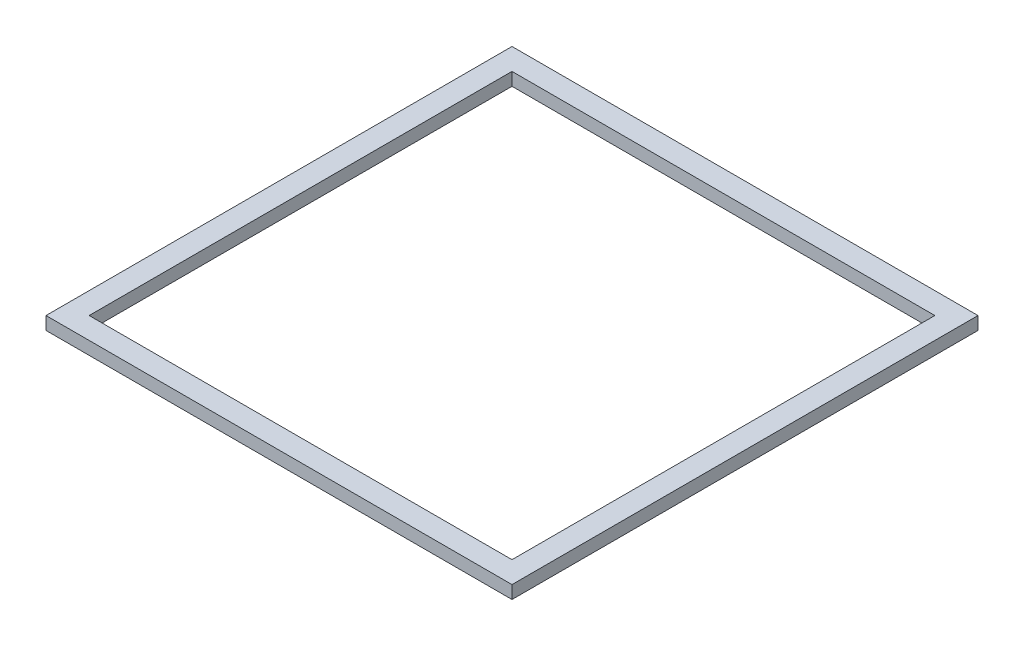
ISO-10303-21;
HEADER;
FILE_DESCRIPTION(('STEP AP214'),'2;1');
FILE_NAME('part.step','',(''),(''),'','','');
FILE_SCHEMA(('AUTOMOTIVE_DESIGN { 1 0 10303 214 1 1 1 1 }'));
ENDSEC;
DATA;
#1=APPLICATION_CONTEXT('core data for automotive mechanical design processes');
#2=APPLICATION_PROTOCOL_DEFINITION('international standard','automotive_design',2000,#1);
#3=PRODUCT_CONTEXT('',#1,'mechanical');
#4=PRODUCT('Part','Part','',(#3));
#5=PRODUCT_RELATED_PRODUCT_CATEGORY('part','',(#4));
#6=PRODUCT_DEFINITION_FORMATION('','',#4);
#7=PRODUCT_DEFINITION_CONTEXT('part definition',#1,'design');
#8=PRODUCT_DEFINITION('design','',#6,#7);
#9=PRODUCT_DEFINITION_SHAPE('','',#8);
#10=(LENGTH_UNIT() NAMED_UNIT(*) SI_UNIT(.MILLI.,.METRE.));
#11=(NAMED_UNIT(*) PLANE_ANGLE_UNIT() SI_UNIT($,.RADIAN.));
#12=(NAMED_UNIT(*) SI_UNIT($,.STERADIAN.) SOLID_ANGLE_UNIT());
#13=UNCERTAINTY_MEASURE_WITH_UNIT(LENGTH_MEASURE(1.E-05),#10,'distance_accuracy_value','');
#14=(GEOMETRIC_REPRESENTATION_CONTEXT(3) GLOBAL_UNCERTAINTY_ASSIGNED_CONTEXT((#13)) GLOBAL_UNIT_ASSIGNED_CONTEXT((#10,
#11,#12)) REPRESENTATION_CONTEXT('',''));
#15=CARTESIAN_POINT('',(0.,0.,0.));
#16=DIRECTION('',(0.,0.,1.));
#17=DIRECTION('',(1.,0.,0.));
#18=AXIS2_PLACEMENT_3D('',#15,#16,#17);
#19=CARTESIAN_POINT('',(0.,3.,0.));
#20=DIRECTION('',(0.,-1.,0.));
#21=DIRECTION('',(0.,0.,-1.));
#22=AXIS2_PLACEMENT_3D('',#19,#20,#21);
#23=PLANE('',#22);
#24=DIRECTION('',(0.,0.,-1.));
#25=VECTOR('',#24,1.);
#26=CARTESIAN_POINT('',(54.,3.,54.));
#27=LINE('',#26,#25);
#28=CARTESIAN_POINT('',(54.,3.,54.));
#29=VERTEX_POINT('',#28);
#30=CARTESIAN_POINT('',(54.,3.,-54.));
#31=VERTEX_POINT('',#30);
#32=EDGE_CURVE('E136',#29,#31,#27,.T.);
#33=ORIENTED_EDGE('',*,*,#32,.T.);
#34=DIRECTION('',(-1.,0.,0.));
#35=VECTOR('',#34,1.);
#36=CARTESIAN_POINT('',(-54.,3.,-54.));
#37=LINE('',#36,#35);
#38=CARTESIAN_POINT('',(-54.,3.,-54.));
#39=VERTEX_POINT('',#38);
#40=EDGE_CURVE('E139',#31,#39,#37,.T.);
#41=ORIENTED_EDGE('',*,*,#40,.T.);
#42=DIRECTION('',(0.,0.,1.));
#43=VECTOR('',#42,1.);
#44=CARTESIAN_POINT('',(-54.,3.,54.));
#45=LINE('',#44,#43);
#46=CARTESIAN_POINT('',(-54.,3.,54.));
#47=VERTEX_POINT('',#46);
#48=EDGE_CURVE('E142',#39,#47,#45,.T.);
#49=ORIENTED_EDGE('',*,*,#48,.T.);
#50=DIRECTION('',(1.,0.,0.));
#51=VECTOR('',#50,1.);
#52=CARTESIAN_POINT('',(-54.,3.,54.));
#53=LINE('',#52,#51);
#54=EDGE_CURVE('E144',#47,#29,#53,.T.);
#55=ORIENTED_EDGE('',*,*,#54,.T.);
#56=EDGE_LOOP('',(#33,#41,#49,#55));
#57=FACE_BOUND('',#56,.T.);
#58=DIRECTION('',(0.,0.,-1.));
#59=VECTOR('',#58,1.);
#60=CARTESIAN_POINT('',(49.,3.,49.));
#61=LINE('',#60,#59);
#62=CARTESIAN_POINT('',(49.,3.,49.));
#63=VERTEX_POINT('',#62);
#64=CARTESIAN_POINT('',(49.,3.,-49.));
#65=VERTEX_POINT('',#64);
#66=EDGE_CURVE('E100',#63,#65,#61,.T.);
#67=ORIENTED_EDGE('',*,*,#66,.F.);
#68=DIRECTION('',(1.,0.,0.));
#69=VECTOR('',#68,1.);
#70=CARTESIAN_POINT('',(-49.,3.,49.));
#71=LINE('',#70,#69);
#72=CARTESIAN_POINT('',(-49.,3.,49.));
#73=VERTEX_POINT('',#72);
#74=EDGE_CURVE('E122',#73,#63,#71,.T.);
#75=ORIENTED_EDGE('',*,*,#74,.F.);
#76=DIRECTION('',(0.,0.,1.));
#77=VECTOR('',#76,1.);
#78=CARTESIAN_POINT('',(-49.,3.,49.));
#79=LINE('',#78,#77);
#80=CARTESIAN_POINT('',(-49.,3.,-49.));
#81=VERTEX_POINT('',#80);
#82=EDGE_CURVE('E120',#81,#73,#79,.T.);
#83=ORIENTED_EDGE('',*,*,#82,.F.);
#84=DIRECTION('',(-1.,0.,0.));
#85=VECTOR('',#84,1.);
#86=CARTESIAN_POINT('',(-49.,3.,-49.));
#87=LINE('',#86,#85);
#88=EDGE_CURVE('E108',#65,#81,#87,.T.);
#89=ORIENTED_EDGE('',*,*,#88,.F.);
#90=EDGE_LOOP('',(#67,#75,#83,#89));
#91=FACE_BOUND('',#90,.T.);
#92=ADVANCED_FACE('F35',(#57,#91),#23,.F.);
#93=CARTESIAN_POINT('',(0.,0.,0.));
#94=DIRECTION('',(0.,-1.,0.));
#95=DIRECTION('',(0.,0.,-1.));
#96=AXIS2_PLACEMENT_3D('',#93,#94,#95);
#97=PLANE('',#96);
#98=DIRECTION('',(0.,0.,-1.));
#99=VECTOR('',#98,1.);
#100=CARTESIAN_POINT('',(54.,0.,54.));
#101=LINE('',#100,#99);
#102=CARTESIAN_POINT('',(54.,0.,54.));
#103=VERTEX_POINT('',#102);
#104=CARTESIAN_POINT('',(54.,0.,-54.));
#105=VERTEX_POINT('',#104);
#106=EDGE_CURVE('E116',#103,#105,#101,.T.);
#107=ORIENTED_EDGE('',*,*,#106,.F.);
#108=DIRECTION('',(1.,0.,0.));
#109=VECTOR('',#108,1.);
#110=CARTESIAN_POINT('',(-54.,0.,54.));
#111=LINE('',#110,#109);
#112=CARTESIAN_POINT('',(-54.,0.,54.));
#113=VERTEX_POINT('',#112);
#114=EDGE_CURVE('E140',#113,#103,#111,.T.);
#115=ORIENTED_EDGE('',*,*,#114,.F.);
#116=DIRECTION('',(0.,0.,1.));
#117=VECTOR('',#116,1.);
#118=CARTESIAN_POINT('',(-54.,0.,54.));
#119=LINE('',#118,#117);
#120=CARTESIAN_POINT('',(-54.,0.,-54.));
#121=VERTEX_POINT('',#120);
#122=EDGE_CURVE('E151',#121,#113,#119,.T.);
#123=ORIENTED_EDGE('',*,*,#122,.F.);
#124=DIRECTION('',(-1.,0.,0.));
#125=VECTOR('',#124,1.);
#126=CARTESIAN_POINT('',(-54.,0.,-54.));
#127=LINE('',#126,#125);
#128=EDGE_CURVE('E149',#105,#121,#127,.T.);
#129=ORIENTED_EDGE('',*,*,#128,.F.);
#130=EDGE_LOOP('',(#107,#115,#123,#129));
#131=FACE_BOUND('',#130,.T.);
#132=DIRECTION('',(1.,0.,0.));
#133=VECTOR('',#132,1.);
#134=CARTESIAN_POINT('',(-49.,0.,49.));
#135=LINE('',#134,#133);
#136=CARTESIAN_POINT('',(-49.,0.,49.));
#137=VERTEX_POINT('',#136);
#138=CARTESIAN_POINT('',(49.,0.,49.));
#139=VERTEX_POINT('',#138);
#140=EDGE_CURVE('E109',#137,#139,#135,.T.);
#141=ORIENTED_EDGE('',*,*,#140,.T.);
#142=DIRECTION('',(0.,0.,-1.));
#143=VECTOR('',#142,1.);
#144=CARTESIAN_POINT('',(49.,0.,49.));
#145=LINE('',#144,#143);
#146=CARTESIAN_POINT('',(49.,0.,-49.));
#147=VERTEX_POINT('',#146);
#148=EDGE_CURVE('E58',#139,#147,#145,.T.);
#149=ORIENTED_EDGE('',*,*,#148,.T.);
#150=DIRECTION('',(-1.,0.,0.));
#151=VECTOR('',#150,1.);
#152=CARTESIAN_POINT('',(-49.,0.,-49.));
#153=LINE('',#152,#151);
#154=CARTESIAN_POINT('',(-49.,0.,-49.));
#155=VERTEX_POINT('',#154);
#156=EDGE_CURVE('E115',#147,#155,#153,.T.);
#157=ORIENTED_EDGE('',*,*,#156,.T.);
#158=DIRECTION('',(0.,0.,1.));
#159=VECTOR('',#158,1.);
#160=CARTESIAN_POINT('',(-49.,0.,49.));
#161=LINE('',#160,#159);
#162=EDGE_CURVE('E128',#155,#137,#161,.T.);
#163=ORIENTED_EDGE('',*,*,#162,.T.);
#164=EDGE_LOOP('',(#141,#149,#157,#163));
#165=FACE_BOUND('',#164,.T.);
#166=ADVANCED_FACE('F169',(#131,#165),#97,.T.);
#167=CARTESIAN_POINT('',(54.,3.,54.));
#168=DIRECTION('',(-1.,0.,0.));
#169=DIRECTION('',(0.,0.,1.));
#170=AXIS2_PLACEMENT_3D('',#167,#168,#169);
#171=PLANE('',#170);
#172=ORIENTED_EDGE('',*,*,#106,.T.);
#173=DIRECTION('',(0.,-1.,0.));
#174=VECTOR('',#173,1.);
#175=CARTESIAN_POINT('',(54.,3.,-54.));
#176=LINE('',#175,#174);
#177=EDGE_CURVE('E11',#31,#105,#176,.T.);
#178=ORIENTED_EDGE('',*,*,#177,.F.);
#179=ORIENTED_EDGE('',*,*,#32,.F.);
#180=DIRECTION('',(0.,-1.,0.));
#181=VECTOR('',#180,1.);
#182=CARTESIAN_POINT('',(54.,3.,54.));
#183=LINE('',#182,#181);
#184=EDGE_CURVE('E146',#29,#103,#183,.T.);
#185=ORIENTED_EDGE('',*,*,#184,.T.);
#186=EDGE_LOOP('',(#172,#178,#179,#185));
#187=FACE_BOUND('',#186,.T.);
#188=ADVANCED_FACE('F37',(#187),#171,.F.);
#189=CARTESIAN_POINT('',(-54.,3.,-54.));
#190=DIRECTION('',(0.,0.,1.));
#191=DIRECTION('',(1.,0.,0.));
#192=AXIS2_PLACEMENT_3D('',#189,#190,#191);
#193=PLANE('',#192);
#194=ORIENTED_EDGE('',*,*,#128,.T.);
#195=DIRECTION('',(0.,-1.,0.));
#196=VECTOR('',#195,1.);
#197=CARTESIAN_POINT('',(-54.,3.,-54.));
#198=LINE('',#197,#196);
#199=EDGE_CURVE('E43',#39,#121,#198,.T.);
#200=ORIENTED_EDGE('',*,*,#199,.F.);
#201=ORIENTED_EDGE('',*,*,#40,.F.);
#202=ORIENTED_EDGE('',*,*,#177,.T.);
#203=EDGE_LOOP('',(#194,#200,#201,#202));
#204=FACE_BOUND('',#203,.T.);
#205=ADVANCED_FACE('F179',(#204),#193,.F.);
#206=CARTESIAN_POINT('',(-54.,3.,54.));
#207=DIRECTION('',(1.,0.,0.));
#208=DIRECTION('',(0.,0.,-1.));
#209=AXIS2_PLACEMENT_3D('',#206,#207,#208);
#210=PLANE('',#209);
#211=ORIENTED_EDGE('',*,*,#122,.T.);
#212=DIRECTION('',(0.,-1.,0.));
#213=VECTOR('',#212,1.);
#214=CARTESIAN_POINT('',(-54.,3.,54.));
#215=LINE('',#214,#213);
#216=EDGE_CURVE('E156',#47,#113,#215,.T.);
#217=ORIENTED_EDGE('',*,*,#216,.F.);
#218=ORIENTED_EDGE('',*,*,#48,.F.);
#219=ORIENTED_EDGE('',*,*,#199,.T.);
#220=EDGE_LOOP('',(#211,#217,#218,#219));
#221=FACE_BOUND('',#220,.T.);
#222=ADVANCED_FACE('F163',(#221),#210,.F.);
#223=CARTESIAN_POINT('',(-54.,3.,54.));
#224=DIRECTION('',(0.,0.,-1.));
#225=DIRECTION('',(-1.,0.,0.));
#226=AXIS2_PLACEMENT_3D('',#223,#224,#225);
#227=PLANE('',#226);
#228=ORIENTED_EDGE('',*,*,#114,.T.);
#229=ORIENTED_EDGE('',*,*,#184,.F.);
#230=ORIENTED_EDGE('',*,*,#54,.F.);
#231=ORIENTED_EDGE('',*,*,#216,.T.);
#232=EDGE_LOOP('',(#228,#229,#230,#231));
#233=FACE_BOUND('',#232,.T.);
#234=ADVANCED_FACE('F173',(#233),#227,.F.);
#235=CARTESIAN_POINT('',(49.,3.,49.));
#236=DIRECTION('',(-1.,0.,0.));
#237=DIRECTION('',(0.,0.,1.));
#238=AXIS2_PLACEMENT_3D('',#235,#236,#237);
#239=PLANE('',#238);
#240=ORIENTED_EDGE('',*,*,#148,.F.);
#241=DIRECTION('',(0.,-1.,0.));
#242=VECTOR('',#241,1.);
#243=CARTESIAN_POINT('',(49.,3.,49.));
#244=LINE('',#243,#242);
#245=EDGE_CURVE('E104',#63,#139,#244,.T.);
#246=ORIENTED_EDGE('',*,*,#245,.F.);
#247=ORIENTED_EDGE('',*,*,#66,.T.);
#248=DIRECTION('',(0.,-1.,0.));
#249=VECTOR('',#248,1.);
#250=CARTESIAN_POINT('',(49.,3.,-49.));
#251=LINE('',#250,#249);
#252=EDGE_CURVE('E103',#65,#147,#251,.T.);
#253=ORIENTED_EDGE('',*,*,#252,.T.);
#254=EDGE_LOOP('',(#240,#246,#247,#253));
#255=FACE_BOUND('',#254,.T.);
#256=ADVANCED_FACE('F102',(#255),#239,.T.);
#257=CARTESIAN_POINT('',(-49.,3.,-49.));
#258=DIRECTION('',(0.,0.,1.));
#259=DIRECTION('',(1.,0.,0.));
#260=AXIS2_PLACEMENT_3D('',#257,#258,#259);
#261=PLANE('',#260);
#262=ORIENTED_EDGE('',*,*,#156,.F.);
#263=ORIENTED_EDGE('',*,*,#252,.F.);
#264=ORIENTED_EDGE('',*,*,#88,.T.);
#265=DIRECTION('',(0.,-1.,0.));
#266=VECTOR('',#265,1.);
#267=CARTESIAN_POINT('',(-49.,3.,-49.));
#268=LINE('',#267,#266);
#269=EDGE_CURVE('E117',#81,#155,#268,.T.);
#270=ORIENTED_EDGE('',*,*,#269,.T.);
#271=EDGE_LOOP('',(#262,#263,#264,#270));
#272=FACE_BOUND('',#271,.T.);
#273=ADVANCED_FACE('F112',(#272),#261,.T.);
#274=CARTESIAN_POINT('',(-49.,3.,49.));
#275=DIRECTION('',(1.,0.,0.));
#276=DIRECTION('',(0.,0.,-1.));
#277=AXIS2_PLACEMENT_3D('',#274,#275,#276);
#278=PLANE('',#277);
#279=ORIENTED_EDGE('',*,*,#162,.F.);
#280=ORIENTED_EDGE('',*,*,#269,.F.);
#281=ORIENTED_EDGE('',*,*,#82,.T.);
#282=DIRECTION('',(0.,-1.,0.));
#283=VECTOR('',#282,1.);
#284=CARTESIAN_POINT('',(-49.,3.,49.));
#285=LINE('',#284,#283);
#286=EDGE_CURVE('E50',#73,#137,#285,.T.);
#287=ORIENTED_EDGE('',*,*,#286,.T.);
#288=EDGE_LOOP('',(#279,#280,#281,#287));
#289=FACE_BOUND('',#288,.T.);
#290=ADVANCED_FACE('F202',(#289),#278,.T.);
#291=CARTESIAN_POINT('',(-49.,3.,49.));
#292=DIRECTION('',(0.,0.,-1.));
#293=DIRECTION('',(-1.,0.,0.));
#294=AXIS2_PLACEMENT_3D('',#291,#292,#293);
#295=PLANE('',#294);
#296=ORIENTED_EDGE('',*,*,#140,.F.);
#297=ORIENTED_EDGE('',*,*,#286,.F.);
#298=ORIENTED_EDGE('',*,*,#74,.T.);
#299=ORIENTED_EDGE('',*,*,#245,.T.);
#300=EDGE_LOOP('',(#296,#297,#298,#299));
#301=FACE_BOUND('',#300,.T.);
#302=ADVANCED_FACE('F206',(#301),#295,.T.);
#303=CLOSED_SHELL('',(#92,#166,#188,#205,#222,#234,#256,#273,#290,#302));
#304=MANIFOLD_SOLID_BREP('B2',#303);
#305=ADVANCED_BREP_SHAPE_REPRESENTATION('',(#18,#304),#14);
#306=SHAPE_DEFINITION_REPRESENTATION(#9,#305);
ENDSEC;
END-ISO-10303-21;
